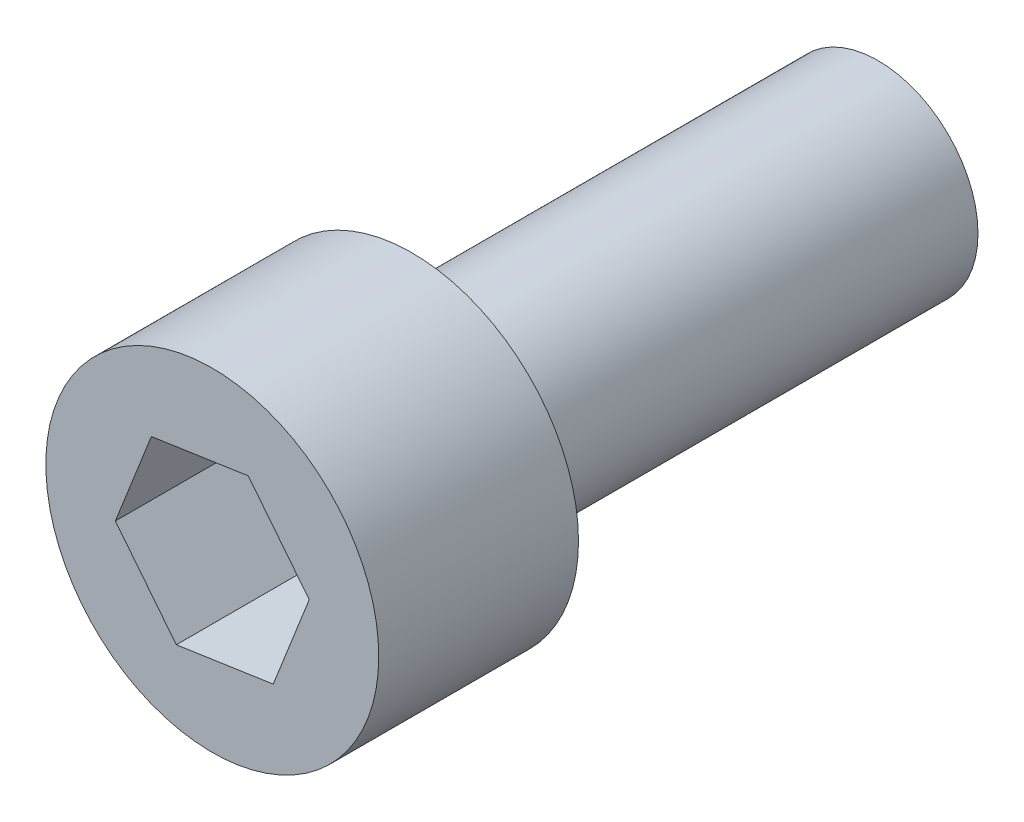
ISO-10303-21;
HEADER;
FILE_DESCRIPTION(('STEP AP214'),'2;1');
FILE_NAME('part.step','',(''),(''),'','','');
FILE_SCHEMA(('AUTOMOTIVE_DESIGN { 1 0 10303 214 1 1 1 1 }'));
ENDSEC;
DATA;
#1=APPLICATION_CONTEXT('core data for automotive mechanical design processes');
#2=APPLICATION_PROTOCOL_DEFINITION('international standard','automotive_design',2000,#1);
#3=PRODUCT_CONTEXT('',#1,'mechanical');
#4=PRODUCT('Part','Part','',(#3));
#5=PRODUCT_RELATED_PRODUCT_CATEGORY('part','',(#4));
#6=PRODUCT_DEFINITION_FORMATION('','',#4);
#7=PRODUCT_DEFINITION_CONTEXT('part definition',#1,'design');
#8=PRODUCT_DEFINITION('design','',#6,#7);
#9=PRODUCT_DEFINITION_SHAPE('','',#8);
#10=(LENGTH_UNIT() NAMED_UNIT(*) SI_UNIT(.MILLI.,.METRE.));
#11=(NAMED_UNIT(*) PLANE_ANGLE_UNIT() SI_UNIT($,.RADIAN.));
#12=(NAMED_UNIT(*) SI_UNIT($,.STERADIAN.) SOLID_ANGLE_UNIT());
#13=UNCERTAINTY_MEASURE_WITH_UNIT(LENGTH_MEASURE(1.E-05),#10,'distance_accuracy_value','');
#14=(GEOMETRIC_REPRESENTATION_CONTEXT(3) GLOBAL_UNCERTAINTY_ASSIGNED_CONTEXT((#13)) GLOBAL_UNIT_ASSIGNED_CONTEXT((#10,
#11,#12)) REPRESENTATION_CONTEXT('',''));
#15=CARTESIAN_POINT('',(0.,0.,0.));
#16=DIRECTION('',(0.,0.,1.));
#17=DIRECTION('',(1.,0.,0.));
#18=AXIS2_PLACEMENT_3D('',#15,#16,#17);
#19=CARTESIAN_POINT('',(0.,0.,15.));
#20=DIRECTION('',(0.,0.,-1.));
#21=DIRECTION('',(-1.,0.,0.));
#22=AXIS2_PLACEMENT_3D('',#19,#20,#21);
#23=CYLINDRICAL_SURFACE('',#22,3.);
#24=CARTESIAN_POINT('',(0.,0.,0.));
#25=DIRECTION('',(0.,0.,1.));
#26=DIRECTION('',(1.,0.,0.));
#27=AXIS2_PLACEMENT_3D('',#24,#25,#26);
#28=CIRCLE('',#27,3.);
#29=CARTESIAN_POINT('',(3.,0.,0.));
#30=VERTEX_POINT('',#29);
#31=EDGE_CURVE('E130',#30,#30,#28,.T.);
#32=ORIENTED_EDGE('',*,*,#31,.T.);
#33=EDGE_LOOP('',(#32));
#34=FACE_BOUND('',#33,.T.);
#35=CARTESIAN_POINT('',(0.,0.,14.));
#36=DIRECTION('',(0.,0.,1.));
#37=DIRECTION('',(1.,0.,0.));
#38=AXIS2_PLACEMENT_3D('',#35,#36,#37);
#39=CIRCLE('',#38,3.);
#40=CARTESIAN_POINT('',(3.,0.,14.));
#41=VERTEX_POINT('',#40);
#42=EDGE_CURVE('E11',#41,#41,#39,.T.);
#43=ORIENTED_EDGE('',*,*,#42,.F.);
#44=EDGE_LOOP('',(#43));
#45=FACE_BOUND('',#44,.T.);
#46=ADVANCED_FACE('F33',(#34,#45),#23,.T.);
#47=CARTESIAN_POINT('',(0.,0.,0.));
#48=DIRECTION('',(0.,0.,1.));
#49=DIRECTION('',(1.,0.,0.));
#50=AXIS2_PLACEMENT_3D('',#47,#48,#49);
#51=PLANE('',#50);
#52=ORIENTED_EDGE('',*,*,#31,.F.);
#53=EDGE_LOOP('',(#52));
#54=FACE_BOUND('',#53,.T.);
#55=ADVANCED_FACE('F163',(#54),#51,.F.);
#56=CARTESIAN_POINT('',(0.,0.,14.));
#57=DIRECTION('',(0.,0.,1.));
#58=DIRECTION('',(1.,0.,0.));
#59=AXIS2_PLACEMENT_3D('',#56,#57,#58);
#60=PLANE('',#59);
#61=CARTESIAN_POINT('',(0.,0.,14.));
#62=DIRECTION('',(0.,0.,1.));
#63=DIRECTION('',(1.,0.,0.));
#64=AXIS2_PLACEMENT_3D('',#61,#62,#63);
#65=CIRCLE('',#64,5.);
#66=CARTESIAN_POINT('',(5.,0.,14.));
#67=VERTEX_POINT('',#66);
#68=EDGE_CURVE('E93',#67,#67,#65,.T.);
#69=ORIENTED_EDGE('',*,*,#68,.F.);
#70=EDGE_LOOP('',(#69));
#71=FACE_BOUND('',#70,.T.);
#72=ORIENTED_EDGE('',*,*,#42,.T.);
#73=EDGE_LOOP('',(#72));
#74=FACE_BOUND('',#73,.T.);
#75=ADVANCED_FACE('F168',(#71,#74),#60,.F.);
#76=CARTESIAN_POINT('',(0.,0.,20.));
#77=DIRECTION('',(0.,0.,1.));
#78=DIRECTION('',(1.,0.,0.));
#79=AXIS2_PLACEMENT_3D('',#76,#77,#78);
#80=PLANE('',#79);
#81=CARTESIAN_POINT('',(0.,0.,20.));
#82=DIRECTION('',(0.,0.,1.));
#83=DIRECTION('',(1.,0.,0.));
#84=AXIS2_PLACEMENT_3D('',#81,#82,#83);
#85=CIRCLE('',#84,5.);
#86=CARTESIAN_POINT('',(5.,0.,20.));
#87=VERTEX_POINT('',#86);
#88=EDGE_CURVE('E99',#87,#87,#85,.T.);
#89=ORIENTED_EDGE('',*,*,#88,.T.);
#90=EDGE_LOOP('',(#89));
#91=FACE_BOUND('',#90,.T.);
#92=DIRECTION('',(-0.36733048998723,-0.930090485450605,0.));
#93=VECTOR('',#92,1.);
#94=CARTESIAN_POINT('',(-1.83018778744589,2.30507616378026,20.));
#95=LINE('',#94,#93);
#96=CARTESIAN_POINT('',(-1.83018778744589,2.30507616378026,20.));
#97=VERTEX_POINT('',#96);
#98=CARTESIAN_POINT('',(-2.91134840921463,-0.432451035734052,20.));
#99=VERTEX_POINT('',#98);
#100=EDGE_CURVE('E92',#97,#99,#95,.T.);
#101=ORIENTED_EDGE('',*,*,#100,.F.);
#102=DIRECTION('',(-0.989147233212039,-0.146927706811776,0.));
#103=VECTOR('',#102,1.);
#104=CARTESIAN_POINT('',(1.08116062176873,2.73752719951431,20.));
#105=LINE('',#104,#103);
#106=CARTESIAN_POINT('',(1.08116062176873,2.73752719951431,20.));
#107=VERTEX_POINT('',#106);
#108=EDGE_CURVE('E83',#107,#97,#105,.T.);
#109=ORIENTED_EDGE('',*,*,#108,.F.);
#110=DIRECTION('',(-0.62181674322481,0.783162778638829,0.));
#111=VECTOR('',#110,1.);
#112=CARTESIAN_POINT('',(2.91134840921463,0.432451035734051,20.));
#113=LINE('',#112,#111);
#114=CARTESIAN_POINT('',(2.91134840921463,0.432451035734051,20.));
#115=VERTEX_POINT('',#114);
#116=EDGE_CURVE('E115',#115,#107,#113,.T.);
#117=ORIENTED_EDGE('',*,*,#116,.F.);
#118=DIRECTION('',(0.36733048998723,0.930090485450605,0.));
#119=VECTOR('',#118,1.);
#120=CARTESIAN_POINT('',(1.83018778744589,-2.30507616378026,20.));
#121=LINE('',#120,#119);
#122=CARTESIAN_POINT('',(1.83018778744589,-2.30507616378026,20.));
#123=VERTEX_POINT('',#122);
#124=EDGE_CURVE('E112',#123,#115,#121,.T.);
#125=ORIENTED_EDGE('',*,*,#124,.F.);
#126=DIRECTION('',(0.989147233212039,0.146927706811776,0.));
#127=VECTOR('',#126,1.);
#128=CARTESIAN_POINT('',(-1.08116062176873,-2.73752719951431,20.));
#129=LINE('',#128,#127);
#130=CARTESIAN_POINT('',(-1.08116062176873,-2.73752719951431,20.));
#131=VERTEX_POINT('',#130);
#132=EDGE_CURVE('E107',#131,#123,#129,.T.);
#133=ORIENTED_EDGE('',*,*,#132,.F.);
#134=DIRECTION('',(0.62181674322481,-0.783162778638829,0.));
#135=VECTOR('',#134,1.);
#136=CARTESIAN_POINT('',(-2.91134840921463,-0.432451035734052,20.));
#137=LINE('',#136,#135);
#138=EDGE_CURVE('E105',#99,#131,#137,.T.);
#139=ORIENTED_EDGE('',*,*,#138,.F.);
#140=EDGE_LOOP('',(#101,#109,#117,#125,#133,#139));
#141=FACE_BOUND('',#140,.T.);
#142=ADVANCED_FACE('F103',(#91,#141),#80,.T.);
#143=CARTESIAN_POINT('',(0.,0.,20.));
#144=DIRECTION('',(0.,0.,-1.));
#145=DIRECTION('',(-1.,0.,0.));
#146=AXIS2_PLACEMENT_3D('',#143,#144,#145);
#147=CYLINDRICAL_SURFACE('',#146,5.);
#148=ORIENTED_EDGE('',*,*,#88,.F.);
#149=EDGE_LOOP('',(#148));
#150=FACE_BOUND('',#149,.T.);
#151=ORIENTED_EDGE('',*,*,#68,.T.);
#152=EDGE_LOOP('',(#151));
#153=FACE_BOUND('',#152,.T.);
#154=ADVANCED_FACE('F180',(#150,#153),#147,.T.);
#155=CARTESIAN_POINT('',(1.08116062176873,2.73752719951431,20.));
#156=DIRECTION('',(0.146927706811776,-0.98914723321204,0.));
#157=DIRECTION('',(0.98914723321204,0.146927706811776,0.));
#158=AXIS2_PLACEMENT_3D('',#155,#156,#157);
#159=PLANE('',#158);
#160=DIRECTION('',(0.,0.,-1.));
#161=VECTOR('',#160,1.);
#162=CARTESIAN_POINT('',(-1.83018778744589,2.30507616378026,20.));
#163=LINE('',#162,#161);
#164=CARTESIAN_POINT('',(-1.83018778744589,2.30507616378026,15.));
#165=VERTEX_POINT('',#164);
#166=EDGE_CURVE('E86',#97,#165,#163,.T.);
#167=ORIENTED_EDGE('',*,*,#166,.T.);
#168=DIRECTION('',(0.98914723321204,0.146927706811776,0.));
#169=VECTOR('',#168,1.);
#170=CARTESIAN_POINT('',(-0.37451358283858,2.52130168164728,15.));
#171=LINE('',#170,#169);
#172=CARTESIAN_POINT('',(1.08116062176873,2.73752719951431,15.));
#173=VERTEX_POINT('',#172);
#174=EDGE_CURVE('E40',#165,#173,#171,.T.);
#175=ORIENTED_EDGE('',*,*,#174,.T.);
#176=DIRECTION('',(0.,0.,-1.));
#177=VECTOR('',#176,1.);
#178=CARTESIAN_POINT('',(1.08116062176873,2.73752719951431,20.));
#179=LINE('',#178,#177);
#180=EDGE_CURVE('E88',#107,#173,#179,.T.);
#181=ORIENTED_EDGE('',*,*,#180,.F.);
#182=ORIENTED_EDGE('',*,*,#108,.T.);
#183=EDGE_LOOP('',(#167,#175,#181,#182));
#184=FACE_BOUND('',#183,.T.);
#185=ADVANCED_FACE('F85',(#184),#159,.T.);
#186=CARTESIAN_POINT('',(-1.83018778744589,2.30507616378026,20.));
#187=DIRECTION('',(0.930090485450605,-0.36733048998723,0.));
#188=DIRECTION('',(0.36733048998723,0.930090485450605,0.));
#189=AXIS2_PLACEMENT_3D('',#186,#187,#188);
#190=PLANE('',#189);
#191=DIRECTION('',(0.,0.,-1.));
#192=VECTOR('',#191,1.);
#193=CARTESIAN_POINT('',(-2.91134840921463,-0.432451035734052,20.));
#194=LINE('',#193,#192);
#195=CARTESIAN_POINT('',(-2.91134840921463,-0.432451035734052,15.));
#196=VERTEX_POINT('',#195);
#197=EDGE_CURVE('E100',#99,#196,#194,.T.);
#198=ORIENTED_EDGE('',*,*,#197,.T.);
#199=DIRECTION('',(0.36733048998723,0.930090485450605,0.));
#200=VECTOR('',#199,1.);
#201=CARTESIAN_POINT('',(-2.37076809833026,0.936312564023101,15.));
#202=LINE('',#201,#200);
#203=EDGE_CURVE('E50',#196,#165,#202,.T.);
#204=ORIENTED_EDGE('',*,*,#203,.T.);
#205=ORIENTED_EDGE('',*,*,#166,.F.);
#206=ORIENTED_EDGE('',*,*,#100,.T.);
#207=EDGE_LOOP('',(#198,#204,#205,#206));
#208=FACE_BOUND('',#207,.T.);
#209=ADVANCED_FACE('F97',(#208),#190,.T.);
#210=CARTESIAN_POINT('',(-2.91134840921463,-0.432451035734052,20.));
#211=DIRECTION('',(0.783162778638829,0.62181674322481,0.));
#212=DIRECTION('',(-0.62181674322481,0.783162778638829,0.));
#213=AXIS2_PLACEMENT_3D('',#210,#211,#212);
#214=PLANE('',#213);
#215=DIRECTION('',(0.,0.,-1.));
#216=VECTOR('',#215,1.);
#217=CARTESIAN_POINT('',(-1.08116062176873,-2.73752719951431,20.));
#218=LINE('',#217,#216);
#219=CARTESIAN_POINT('',(-1.08116062176873,-2.73752719951431,15.));
#220=VERTEX_POINT('',#219);
#221=EDGE_CURVE('E124',#131,#220,#218,.T.);
#222=ORIENTED_EDGE('',*,*,#221,.T.);
#223=DIRECTION('',(-0.62181674322481,0.783162778638829,0.));
#224=VECTOR('',#223,1.);
#225=CARTESIAN_POINT('',(-1.99625451549168,-1.58498911762418,15.));
#226=LINE('',#225,#224);
#227=EDGE_CURVE('E142',#220,#196,#226,.T.);
#228=ORIENTED_EDGE('',*,*,#227,.T.);
#229=ORIENTED_EDGE('',*,*,#197,.F.);
#230=ORIENTED_EDGE('',*,*,#138,.T.);
#231=EDGE_LOOP('',(#222,#228,#229,#230));
#232=FACE_BOUND('',#231,.T.);
#233=ADVANCED_FACE('F154',(#232),#214,.T.);
#234=CARTESIAN_POINT('',(-1.08116062176873,-2.73752719951431,20.));
#235=DIRECTION('',(-0.146927706811776,0.98914723321204,0.));
#236=DIRECTION('',(-0.98914723321204,-0.146927706811776,0.));
#237=AXIS2_PLACEMENT_3D('',#234,#235,#236);
#238=PLANE('',#237);
#239=DIRECTION('',(0.,0.,-1.));
#240=VECTOR('',#239,1.);
#241=CARTESIAN_POINT('',(1.83018778744589,-2.30507616378026,20.));
#242=LINE('',#241,#240);
#243=CARTESIAN_POINT('',(1.83018778744589,-2.30507616378026,15.));
#244=VERTEX_POINT('',#243);
#245=EDGE_CURVE('E121',#123,#244,#242,.T.);
#246=ORIENTED_EDGE('',*,*,#245,.T.);
#247=DIRECTION('',(-0.98914723321204,-0.146927706811776,0.));
#248=VECTOR('',#247,1.);
#249=CARTESIAN_POINT('',(0.37451358283858,-2.52130168164728,15.));
#250=LINE('',#249,#248);
#251=EDGE_CURVE('E139',#244,#220,#250,.T.);
#252=ORIENTED_EDGE('',*,*,#251,.T.);
#253=ORIENTED_EDGE('',*,*,#221,.F.);
#254=ORIENTED_EDGE('',*,*,#132,.T.);
#255=EDGE_LOOP('',(#246,#252,#253,#254));
#256=FACE_BOUND('',#255,.T.);
#257=ADVANCED_FACE('F151',(#256),#238,.T.);
#258=CARTESIAN_POINT('',(1.83018778744589,-2.30507616378026,20.));
#259=DIRECTION('',(-0.930090485450605,0.36733048998723,0.));
#260=DIRECTION('',(-0.36733048998723,-0.930090485450605,0.));
#261=AXIS2_PLACEMENT_3D('',#258,#259,#260);
#262=PLANE('',#261);
#263=DIRECTION('',(0.,0.,-1.));
#264=VECTOR('',#263,1.);
#265=CARTESIAN_POINT('',(2.91134840921463,0.432451035734051,20.));
#266=LINE('',#265,#264);
#267=CARTESIAN_POINT('',(2.91134840921463,0.432451035734051,15.));
#268=VERTEX_POINT('',#267);
#269=EDGE_CURVE('E118',#115,#268,#266,.T.);
#270=ORIENTED_EDGE('',*,*,#269,.T.);
#271=DIRECTION('',(-0.36733048998723,-0.930090485450605,0.));
#272=VECTOR('',#271,1.);
#273=CARTESIAN_POINT('',(2.37076809833026,-0.936312564023102,15.));
#274=LINE('',#273,#272);
#275=EDGE_CURVE('E136',#268,#244,#274,.T.);
#276=ORIENTED_EDGE('',*,*,#275,.T.);
#277=ORIENTED_EDGE('',*,*,#245,.F.);
#278=ORIENTED_EDGE('',*,*,#124,.T.);
#279=EDGE_LOOP('',(#270,#276,#277,#278));
#280=FACE_BOUND('',#279,.T.);
#281=ADVANCED_FACE('F149',(#280),#262,.T.);
#282=CARTESIAN_POINT('',(2.91134840921463,0.432451035734051,20.));
#283=DIRECTION('',(-0.783162778638829,-0.62181674322481,0.));
#284=DIRECTION('',(0.62181674322481,-0.783162778638829,0.));
#285=AXIS2_PLACEMENT_3D('',#282,#283,#284);
#286=PLANE('',#285);
#287=ORIENTED_EDGE('',*,*,#180,.T.);
#288=DIRECTION('',(0.62181674322481,-0.783162778638829,0.));
#289=VECTOR('',#288,1.);
#290=CARTESIAN_POINT('',(1.99625451549168,1.58498911762418,15.));
#291=LINE('',#290,#289);
#292=EDGE_CURVE('E133',#173,#268,#291,.T.);
#293=ORIENTED_EDGE('',*,*,#292,.T.);
#294=ORIENTED_EDGE('',*,*,#269,.F.);
#295=ORIENTED_EDGE('',*,*,#116,.T.);
#296=EDGE_LOOP('',(#287,#293,#294,#295));
#297=FACE_BOUND('',#296,.T.);
#298=ADVANCED_FACE('F145',(#297),#286,.T.);
#299=CARTESIAN_POINT('',(0.,0.,15.));
#300=DIRECTION('',(0.,0.,1.));
#301=DIRECTION('',(1.,0.,0.));
#302=AXIS2_PLACEMENT_3D('',#299,#300,#301);
#303=PLANE('',#302);
#304=ORIENTED_EDGE('',*,*,#174,.F.);
#305=ORIENTED_EDGE('',*,*,#203,.F.);
#306=ORIENTED_EDGE('',*,*,#227,.F.);
#307=ORIENTED_EDGE('',*,*,#251,.F.);
#308=ORIENTED_EDGE('',*,*,#275,.F.);
#309=ORIENTED_EDGE('',*,*,#292,.F.);
#310=EDGE_LOOP('',(#304,#305,#306,#307,#308,#309));
#311=FACE_BOUND('',#310,.T.);
#312=ADVANCED_FACE('F155',(#311),#303,.T.);
#313=CLOSED_SHELL('',(#46,#55,#75,#142,#154,#185,#209,#233,#257,#281,#298,#312));
#314=MANIFOLD_SOLID_BREP('B2',#313);
#315=ADVANCED_BREP_SHAPE_REPRESENTATION('',(#18,#314),#14);
#316=SHAPE_DEFINITION_REPRESENTATION(#9,#315);
ENDSEC;
END-ISO-10303-21;
